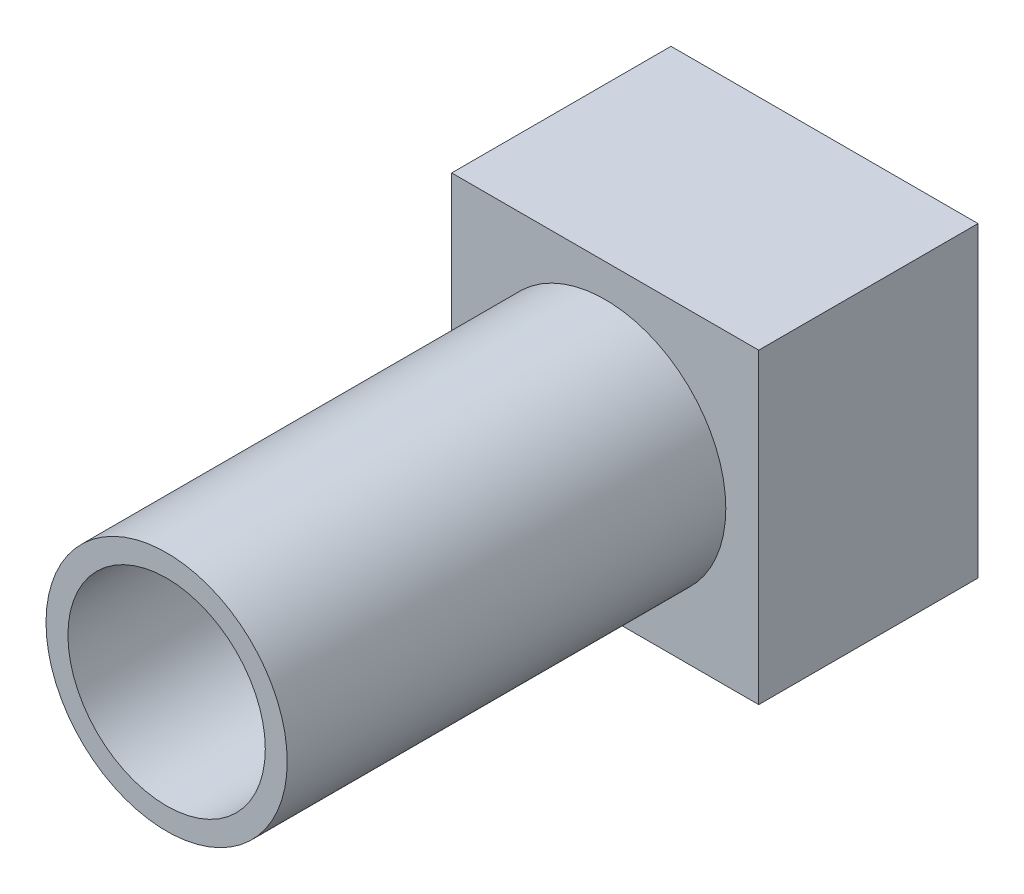
ISO-10303-21;
HEADER;
FILE_DESCRIPTION(('STEP AP214'),'2;1');
FILE_NAME('part.step','',(''),(''),'','','');
FILE_SCHEMA(('AUTOMOTIVE_DESIGN { 1 0 10303 214 1 1 1 1 }'));
ENDSEC;
DATA;
#1=APPLICATION_CONTEXT('core data for automotive mechanical design processes');
#2=APPLICATION_PROTOCOL_DEFINITION('international standard','automotive_design',2000,#1);
#3=PRODUCT_CONTEXT('',#1,'mechanical');
#4=PRODUCT('Part','Part','',(#3));
#5=PRODUCT_RELATED_PRODUCT_CATEGORY('part','',(#4));
#6=PRODUCT_DEFINITION_FORMATION('','',#4);
#7=PRODUCT_DEFINITION_CONTEXT('part definition',#1,'design');
#8=PRODUCT_DEFINITION('design','',#6,#7);
#9=PRODUCT_DEFINITION_SHAPE('','',#8);
#10=(LENGTH_UNIT() NAMED_UNIT(*) SI_UNIT(.MILLI.,.METRE.));
#11=(NAMED_UNIT(*) PLANE_ANGLE_UNIT() SI_UNIT($,.RADIAN.));
#12=(NAMED_UNIT(*) SI_UNIT($,.STERADIAN.) SOLID_ANGLE_UNIT());
#13=UNCERTAINTY_MEASURE_WITH_UNIT(LENGTH_MEASURE(1.E-05),#10,'distance_accuracy_value','');
#14=(GEOMETRIC_REPRESENTATION_CONTEXT(3) GLOBAL_UNCERTAINTY_ASSIGNED_CONTEXT((#13)) GLOBAL_UNIT_ASSIGNED_CONTEXT((#10,
#11,#12)) REPRESENTATION_CONTEXT('',''));
#15=CARTESIAN_POINT('',(0.,0.,0.));
#16=DIRECTION('',(0.,0.,1.));
#17=DIRECTION('',(1.,0.,0.));
#18=AXIS2_PLACEMENT_3D('',#15,#16,#17);
#19=CARTESIAN_POINT('',(0.,-7.,5.));
#20=DIRECTION('',(0.,1.,0.));
#21=DIRECTION('',(0.,0.,1.));
#22=AXIS2_PLACEMENT_3D('',#19,#20,#21);
#23=PLANE('',#22);
#24=DIRECTION('',(1.,0.,0.));
#25=VECTOR('',#24,1.);
#26=CARTESIAN_POINT('',(0.,-7.,0.));
#27=LINE('',#26,#25);
#28=CARTESIAN_POINT('',(-7.,-7.,0.));
#29=VERTEX_POINT('',#28);
#30=CARTESIAN_POINT('',(7.,-7.,0.));
#31=VERTEX_POINT('',#30);
#32=EDGE_CURVE('E163',#29,#31,#27,.T.);
#33=ORIENTED_EDGE('',*,*,#32,.T.);
#34=DIRECTION('',(0.,0.,-1.));
#35=VECTOR('',#34,1.);
#36=CARTESIAN_POINT('',(7.,-7.,5.));
#37=LINE('',#36,#35);
#38=CARTESIAN_POINT('',(7.,-7.,10.));
#39=VERTEX_POINT('',#38);
#40=EDGE_CURVE('E45',#39,#31,#37,.T.);
#41=ORIENTED_EDGE('',*,*,#40,.F.);
#42=DIRECTION('',(1.,0.,0.));
#43=VECTOR('',#42,1.);
#44=CARTESIAN_POINT('',(-7.,-7.,10.));
#45=LINE('',#44,#43);
#46=CARTESIAN_POINT('',(-7.,-7.,10.));
#47=VERTEX_POINT('',#46);
#48=EDGE_CURVE('E131',#47,#39,#45,.T.);
#49=ORIENTED_EDGE('',*,*,#48,.F.);
#50=DIRECTION('',(0.,0.,-1.));
#51=VECTOR('',#50,1.);
#52=CARTESIAN_POINT('',(-7.,-7.,5.));
#53=LINE('',#52,#51);
#54=EDGE_CURVE('E91',#47,#29,#53,.T.);
#55=ORIENTED_EDGE('',*,*,#54,.T.);
#56=EDGE_LOOP('',(#33,#41,#49,#55));
#57=FACE_BOUND('',#56,.T.);
#58=ADVANCED_FACE('F35',(#57),#23,.F.);
#59=CARTESIAN_POINT('',(7.,0.,5.));
#60=DIRECTION('',(-1.,0.,0.));
#61=DIRECTION('',(0.,0.,1.));
#62=AXIS2_PLACEMENT_3D('',#59,#60,#61);
#63=PLANE('',#62);
#64=DIRECTION('',(0.,1.,0.));
#65=VECTOR('',#64,1.);
#66=CARTESIAN_POINT('',(7.,0.,0.));
#67=LINE('',#66,#65);
#68=CARTESIAN_POINT('',(7.,7.,0.));
#69=VERTEX_POINT('',#68);
#70=EDGE_CURVE('E118',#31,#69,#67,.T.);
#71=ORIENTED_EDGE('',*,*,#70,.T.);
#72=DIRECTION('',(0.,0.,-1.));
#73=VECTOR('',#72,1.);
#74=CARTESIAN_POINT('',(7.,7.,5.));
#75=LINE('',#74,#73);
#76=CARTESIAN_POINT('',(7.,7.,10.));
#77=VERTEX_POINT('',#76);
#78=EDGE_CURVE('E112',#77,#69,#75,.T.);
#79=ORIENTED_EDGE('',*,*,#78,.F.);
#80=DIRECTION('',(0.,1.,0.));
#81=VECTOR('',#80,1.);
#82=CARTESIAN_POINT('',(7.,-7.,10.));
#83=LINE('',#82,#81);
#84=EDGE_CURVE('E117',#39,#77,#83,.T.);
#85=ORIENTED_EDGE('',*,*,#84,.F.);
#86=ORIENTED_EDGE('',*,*,#40,.T.);
#87=EDGE_LOOP('',(#71,#79,#85,#86));
#88=FACE_BOUND('',#87,.T.);
#89=ADVANCED_FACE('F114',(#88),#63,.F.);
#90=CARTESIAN_POINT('',(0.,7.,5.));
#91=DIRECTION('',(0.,1.,0.));
#92=DIRECTION('',(0.,0.,1.));
#93=AXIS2_PLACEMENT_3D('',#90,#91,#92);
#94=PLANE('',#93);
#95=DIRECTION('',(1.,0.,0.));
#96=VECTOR('',#95,1.);
#97=CARTESIAN_POINT('',(0.,7.,0.));
#98=LINE('',#97,#96);
#99=CARTESIAN_POINT('',(-7.,7.,0.));
#100=VERTEX_POINT('',#99);
#101=EDGE_CURVE('E166',#100,#69,#98,.T.);
#102=ORIENTED_EDGE('',*,*,#101,.F.);
#103=DIRECTION('',(0.,0.,-1.));
#104=VECTOR('',#103,1.);
#105=CARTESIAN_POINT('',(-7.,7.,5.));
#106=LINE('',#105,#104);
#107=CARTESIAN_POINT('',(-7.,7.,10.));
#108=VERTEX_POINT('',#107);
#109=EDGE_CURVE('E84',#108,#100,#106,.T.);
#110=ORIENTED_EDGE('',*,*,#109,.F.);
#111=DIRECTION('',(-1.,0.,0.));
#112=VECTOR('',#111,1.);
#113=CARTESIAN_POINT('',(-7.,7.,10.));
#114=LINE('',#113,#112);
#115=EDGE_CURVE('E123',#77,#108,#114,.T.);
#116=ORIENTED_EDGE('',*,*,#115,.F.);
#117=ORIENTED_EDGE('',*,*,#78,.T.);
#118=EDGE_LOOP('',(#102,#110,#116,#117));
#119=FACE_BOUND('',#118,.T.);
#120=ADVANCED_FACE('F124',(#119),#94,.T.);
#121=CARTESIAN_POINT('',(5.5,0.,5.));
#122=DIRECTION('',(-1.,0.,0.));
#123=DIRECTION('',(0.,0.,1.));
#124=AXIS2_PLACEMENT_3D('',#121,#122,#123);
#125=PLANE('',#124);
#126=DIRECTION('',(0.,1.,0.));
#127=VECTOR('',#126,1.);
#128=CARTESIAN_POINT('',(5.5,0.,0.));
#129=LINE('',#128,#127);
#130=CARTESIAN_POINT('',(5.5,-5.5,0.));
#131=VERTEX_POINT('',#130);
#132=CARTESIAN_POINT('',(5.5,5.5,0.));
#133=VERTEX_POINT('',#132);
#134=EDGE_CURVE('E140',#131,#133,#129,.T.);
#135=ORIENTED_EDGE('',*,*,#134,.F.);
#136=DIRECTION('',(0.,0.,-1.));
#137=VECTOR('',#136,1.);
#138=CARTESIAN_POINT('',(5.5,-5.5,5.));
#139=LINE('',#138,#137);
#140=CARTESIAN_POINT('',(5.5,-5.5,5.));
#141=VERTEX_POINT('',#140);
#142=EDGE_CURVE('E39',#141,#131,#139,.T.);
#143=ORIENTED_EDGE('',*,*,#142,.F.);
#144=DIRECTION('',(0.,1.,0.));
#145=VECTOR('',#144,1.);
#146=CARTESIAN_POINT('',(5.5,0.,5.));
#147=LINE('',#146,#145);
#148=CARTESIAN_POINT('',(5.5,5.5,5.));
#149=VERTEX_POINT('',#148);
#150=EDGE_CURVE('E141',#141,#149,#147,.T.);
#151=ORIENTED_EDGE('',*,*,#150,.T.);
#152=DIRECTION('',(0.,0.,-1.));
#153=VECTOR('',#152,1.);
#154=CARTESIAN_POINT('',(5.5,5.5,5.));
#155=LINE('',#154,#153);
#156=EDGE_CURVE('E152',#149,#133,#155,.T.);
#157=ORIENTED_EDGE('',*,*,#156,.T.);
#158=EDGE_LOOP('',(#135,#143,#151,#157));
#159=FACE_BOUND('',#158,.T.);
#160=ADVANCED_FACE('F37',(#159),#125,.T.);
#161=CARTESIAN_POINT('',(0.,-5.5,5.));
#162=DIRECTION('',(0.,1.,0.));
#163=DIRECTION('',(0.,0.,1.));
#164=AXIS2_PLACEMENT_3D('',#161,#162,#163);
#165=PLANE('',#164);
#166=DIRECTION('',(1.,0.,0.));
#167=VECTOR('',#166,1.);
#168=CARTESIAN_POINT('',(0.,-5.5,0.));
#169=LINE('',#168,#167);
#170=CARTESIAN_POINT('',(-5.5,-5.5,0.));
#171=VERTEX_POINT('',#170);
#172=EDGE_CURVE('E155',#171,#131,#169,.T.);
#173=ORIENTED_EDGE('',*,*,#172,.F.);
#174=DIRECTION('',(0.,0.,-1.));
#175=VECTOR('',#174,1.);
#176=CARTESIAN_POINT('',(-5.5,-5.5,5.));
#177=LINE('',#176,#175);
#178=CARTESIAN_POINT('',(-5.5,-5.5,5.));
#179=VERTEX_POINT('',#178);
#180=EDGE_CURVE('E174',#179,#171,#177,.T.);
#181=ORIENTED_EDGE('',*,*,#180,.F.);
#182=DIRECTION('',(1.,0.,0.));
#183=VECTOR('',#182,1.);
#184=CARTESIAN_POINT('',(0.,-5.5,5.));
#185=LINE('',#184,#183);
#186=EDGE_CURVE('E143',#179,#141,#185,.T.);
#187=ORIENTED_EDGE('',*,*,#186,.T.);
#188=ORIENTED_EDGE('',*,*,#142,.T.);
#189=EDGE_LOOP('',(#173,#181,#187,#188));
#190=FACE_BOUND('',#189,.T.);
#191=ADVANCED_FACE('F178',(#190),#165,.T.);
#192=CARTESIAN_POINT('',(-5.5,0.,5.));
#193=DIRECTION('',(-1.,0.,0.));
#194=DIRECTION('',(0.,0.,1.));
#195=AXIS2_PLACEMENT_3D('',#192,#193,#194);
#196=PLANE('',#195);
#197=DIRECTION('',(0.,1.,0.));
#198=VECTOR('',#197,1.);
#199=CARTESIAN_POINT('',(-5.5,0.,0.));
#200=LINE('',#199,#198);
#201=CARTESIAN_POINT('',(-5.5,5.5,0.));
#202=VERTEX_POINT('',#201);
#203=EDGE_CURVE('E158',#171,#202,#200,.T.);
#204=ORIENTED_EDGE('',*,*,#203,.T.);
#205=DIRECTION('',(0.,0.,-1.));
#206=VECTOR('',#205,1.);
#207=CARTESIAN_POINT('',(-5.5,5.5,5.));
#208=LINE('',#207,#206);
#209=CARTESIAN_POINT('',(-5.5,5.5,5.));
#210=VERTEX_POINT('',#209);
#211=EDGE_CURVE('E54',#210,#202,#208,.T.);
#212=ORIENTED_EDGE('',*,*,#211,.F.);
#213=DIRECTION('',(0.,1.,0.));
#214=VECTOR('',#213,1.);
#215=CARTESIAN_POINT('',(-5.5,0.,5.));
#216=LINE('',#215,#214);
#217=EDGE_CURVE('E146',#179,#210,#216,.T.);
#218=ORIENTED_EDGE('',*,*,#217,.F.);
#219=ORIENTED_EDGE('',*,*,#180,.T.);
#220=EDGE_LOOP('',(#204,#212,#218,#219));
#221=FACE_BOUND('',#220,.T.);
#222=ADVANCED_FACE('F186',(#221),#196,.F.);
#223=CARTESIAN_POINT('',(0.,5.5,5.));
#224=DIRECTION('',(0.,1.,0.));
#225=DIRECTION('',(0.,0.,1.));
#226=AXIS2_PLACEMENT_3D('',#223,#224,#225);
#227=PLANE('',#226);
#228=DIRECTION('',(1.,0.,0.));
#229=VECTOR('',#228,1.);
#230=CARTESIAN_POINT('',(0.,5.5,0.));
#231=LINE('',#230,#229);
#232=EDGE_CURVE('E160',#202,#133,#231,.T.);
#233=ORIENTED_EDGE('',*,*,#232,.T.);
#234=ORIENTED_EDGE('',*,*,#156,.F.);
#235=DIRECTION('',(1.,0.,0.));
#236=VECTOR('',#235,1.);
#237=CARTESIAN_POINT('',(0.,5.5,5.));
#238=LINE('',#237,#236);
#239=EDGE_CURVE('E149',#210,#149,#238,.T.);
#240=ORIENTED_EDGE('',*,*,#239,.F.);
#241=ORIENTED_EDGE('',*,*,#211,.T.);
#242=EDGE_LOOP('',(#233,#234,#240,#241));
#243=FACE_BOUND('',#242,.T.);
#244=ADVANCED_FACE('F188',(#243),#227,.F.);
#245=CARTESIAN_POINT('',(-7.,0.,5.));
#246=DIRECTION('',(-1.,0.,0.));
#247=DIRECTION('',(0.,0.,1.));
#248=AXIS2_PLACEMENT_3D('',#245,#246,#247);
#249=PLANE('',#248);
#250=DIRECTION('',(0.,1.,0.));
#251=VECTOR('',#250,1.);
#252=CARTESIAN_POINT('',(-7.,0.,0.));
#253=LINE('',#252,#251);
#254=EDGE_CURVE('E144',#29,#100,#253,.T.);
#255=ORIENTED_EDGE('',*,*,#254,.F.);
#256=ORIENTED_EDGE('',*,*,#54,.F.);
#257=DIRECTION('',(0.,-1.,0.));
#258=VECTOR('',#257,1.);
#259=CARTESIAN_POINT('',(-7.,-7.,10.));
#260=LINE('',#259,#258);
#261=EDGE_CURVE('E127',#108,#47,#260,.T.);
#262=ORIENTED_EDGE('',*,*,#261,.F.);
#263=ORIENTED_EDGE('',*,*,#109,.T.);
#264=EDGE_LOOP('',(#255,#256,#262,#263));
#265=FACE_BOUND('',#264,.T.);
#266=ADVANCED_FACE('F201',(#265),#249,.T.);
#267=CARTESIAN_POINT('',(0.,0.,0.));
#268=DIRECTION('',(0.,0.,1.));
#269=DIRECTION('',(1.,0.,0.));
#270=AXIS2_PLACEMENT_3D('',#267,#268,#269);
#271=PLANE('',#270);
#272=ORIENTED_EDGE('',*,*,#134,.T.);
#273=ORIENTED_EDGE('',*,*,#232,.F.);
#274=ORIENTED_EDGE('',*,*,#203,.F.);
#275=ORIENTED_EDGE('',*,*,#172,.T.);
#276=EDGE_LOOP('',(#272,#273,#274,#275));
#277=FACE_BOUND('',#276,.T.);
#278=ORIENTED_EDGE('',*,*,#32,.F.);
#279=ORIENTED_EDGE('',*,*,#254,.T.);
#280=ORIENTED_EDGE('',*,*,#101,.T.);
#281=ORIENTED_EDGE('',*,*,#70,.F.);
#282=EDGE_LOOP('',(#278,#279,#280,#281));
#283=FACE_BOUND('',#282,.T.);
#284=ADVANCED_FACE('F184',(#277,#283),#271,.F.);
#285=CARTESIAN_POINT('',(0.,0.,5.));
#286=DIRECTION('',(0.,0.,-1.));
#287=DIRECTION('',(-1.,0.,0.));
#288=AXIS2_PLACEMENT_3D('',#285,#286,#287);
#289=PLANE('',#288);
#290=CARTESIAN_POINT('',(0.,0.,5.));
#291=DIRECTION('',(0.,0.,-1.));
#292=DIRECTION('',(-1.,0.,0.));
#293=AXIS2_PLACEMENT_3D('',#290,#291,#292);
#294=CIRCLE('',#293,4.5);
#295=CARTESIAN_POINT('',(-4.5,0.,5.));
#296=VERTEX_POINT('',#295);
#297=EDGE_CURVE('E135',#296,#296,#294,.T.);
#298=ORIENTED_EDGE('',*,*,#297,.F.);
#299=EDGE_LOOP('',(#298));
#300=FACE_BOUND('',#299,.T.);
#301=ORIENTED_EDGE('',*,*,#150,.F.);
#302=ORIENTED_EDGE('',*,*,#186,.F.);
#303=ORIENTED_EDGE('',*,*,#217,.T.);
#304=ORIENTED_EDGE('',*,*,#239,.T.);
#305=EDGE_LOOP('',(#301,#302,#303,#304));
#306=FACE_BOUND('',#305,.T.);
#307=ADVANCED_FACE('F190',(#300,#306),#289,.T.);
#308=CARTESIAN_POINT('',(0.,0.,10.));
#309=DIRECTION('',(0.,0.,-1.));
#310=DIRECTION('',(-1.,0.,0.));
#311=AXIS2_PLACEMENT_3D('',#308,#309,#310);
#312=PLANE('',#311);
#313=CARTESIAN_POINT('',(0.,0.,10.));
#314=DIRECTION('',(0.,0.,1.));
#315=DIRECTION('',(1.,0.,0.));
#316=AXIS2_PLACEMENT_3D('',#313,#314,#315);
#317=CIRCLE('',#316,5.5);
#318=CARTESIAN_POINT('',(5.5,0.,10.));
#319=VERTEX_POINT('',#318);
#320=EDGE_CURVE('E11',#319,#319,#317,.T.);
#321=ORIENTED_EDGE('',*,*,#320,.F.);
#322=EDGE_LOOP('',(#321));
#323=FACE_BOUND('',#322,.T.);
#324=ORIENTED_EDGE('',*,*,#84,.T.);
#325=ORIENTED_EDGE('',*,*,#115,.T.);
#326=ORIENTED_EDGE('',*,*,#261,.T.);
#327=ORIENTED_EDGE('',*,*,#48,.T.);
#328=EDGE_LOOP('',(#324,#325,#326,#327));
#329=FACE_BOUND('',#328,.T.);
#330=ADVANCED_FACE('F130',(#323,#329),#312,.F.);
#331=CARTESIAN_POINT('',(0.,0.,30.));
#332=DIRECTION('',(0.,0.,-1.));
#333=DIRECTION('',(-1.,0.,0.));
#334=AXIS2_PLACEMENT_3D('',#331,#332,#333);
#335=CYLINDRICAL_SURFACE('',#334,5.5);
#336=CARTESIAN_POINT('',(0.,0.,30.));
#337=DIRECTION('',(0.,0.,1.));
#338=DIRECTION('',(1.,0.,0.));
#339=AXIS2_PLACEMENT_3D('',#336,#337,#338);
#340=CIRCLE('',#339,5.5);
#341=CARTESIAN_POINT('',(5.5,0.,30.));
#342=VERTEX_POINT('',#341);
#343=EDGE_CURVE('E132',#342,#342,#340,.T.);
#344=ORIENTED_EDGE('',*,*,#343,.F.);
#345=EDGE_LOOP('',(#344));
#346=FACE_BOUND('',#345,.T.);
#347=ORIENTED_EDGE('',*,*,#320,.T.);
#348=EDGE_LOOP('',(#347));
#349=FACE_BOUND('',#348,.T.);
#350=ADVANCED_FACE('F198',(#346,#349),#335,.T.);
#351=CARTESIAN_POINT('',(0.,0.,30.));
#352=DIRECTION('',(0.,0.,1.));
#353=DIRECTION('',(1.,0.,0.));
#354=AXIS2_PLACEMENT_3D('',#351,#352,#353);
#355=PLANE('',#354);
#356=CARTESIAN_POINT('',(0.,0.,30.));
#357=DIRECTION('',(0.,0.,1.));
#358=DIRECTION('',(1.,0.,0.));
#359=AXIS2_PLACEMENT_3D('',#356,#357,#358);
#360=CIRCLE('',#359,4.5);
#361=CARTESIAN_POINT('',(4.5,0.,30.));
#362=VERTEX_POINT('',#361);
#363=EDGE_CURVE('E321',#362,#362,#360,.T.);
#364=ORIENTED_EDGE('',*,*,#363,.F.);
#365=EDGE_LOOP('',(#364));
#366=FACE_BOUND('',#365,.T.);
#367=ORIENTED_EDGE('',*,*,#343,.T.);
#368=EDGE_LOOP('',(#367));
#369=FACE_BOUND('',#368,.T.);
#370=ADVANCED_FACE('F294',(#366,#369),#355,.T.);
#371=CARTESIAN_POINT('',(0.,0.,0.));
#372=DIRECTION('',(0.,0.,1.));
#373=DIRECTION('',(1.,0.,0.));
#374=AXIS2_PLACEMENT_3D('',#371,#372,#373);
#375=CYLINDRICAL_SURFACE('',#374,4.5);
#376=ORIENTED_EDGE('',*,*,#297,.T.);
#377=EDGE_LOOP('',(#376));
#378=FACE_BOUND('',#377,.T.);
#379=ORIENTED_EDGE('',*,*,#363,.T.);
#380=EDGE_LOOP('',(#379));
#381=FACE_BOUND('',#380,.T.);
#382=ADVANCED_FACE('F302',(#378,#381),#375,.F.);
#383=CLOSED_SHELL('',(#58,#89,#120,#160,#191,#222,#244,#266,#284,#307,#330,#350,#370,#382));
#384=MANIFOLD_SOLID_BREP('B2',#383);
#385=ADVANCED_BREP_SHAPE_REPRESENTATION('',(#18,#384),#14);
#386=SHAPE_DEFINITION_REPRESENTATION(#9,#385);
ENDSEC;
END-ISO-10303-21;
